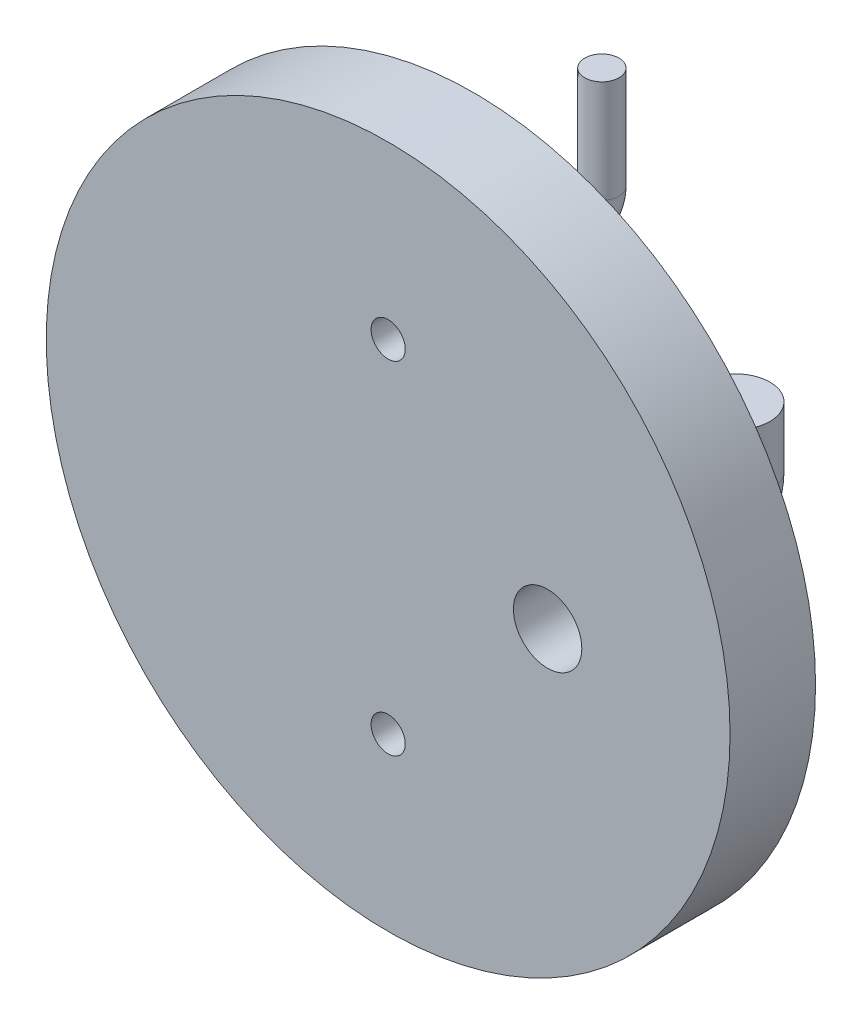
ISO-10303-21;
HEADER;
FILE_DESCRIPTION(('STEP AP214'),'2;1');
FILE_NAME('part.step','',(''),(''),'','','');
FILE_SCHEMA(('AUTOMOTIVE_DESIGN { 1 0 10303 214 1 1 1 1 }'));
ENDSEC;
DATA;
#1=APPLICATION_CONTEXT('core data for automotive mechanical design processes');
#2=APPLICATION_PROTOCOL_DEFINITION('international standard','automotive_design',2000,#1);
#3=PRODUCT_CONTEXT('',#1,'mechanical');
#4=PRODUCT('Part','Part','',(#3));
#5=PRODUCT_RELATED_PRODUCT_CATEGORY('part','',(#4));
#6=PRODUCT_DEFINITION_FORMATION('','',#4);
#7=PRODUCT_DEFINITION_CONTEXT('part definition',#1,'design');
#8=PRODUCT_DEFINITION('design','',#6,#7);
#9=PRODUCT_DEFINITION_SHAPE('','',#8);
#10=(LENGTH_UNIT() NAMED_UNIT(*) SI_UNIT(.MILLI.,.METRE.));
#11=(NAMED_UNIT(*) PLANE_ANGLE_UNIT() SI_UNIT($,.RADIAN.));
#12=(NAMED_UNIT(*) SI_UNIT($,.STERADIAN.) SOLID_ANGLE_UNIT());
#13=UNCERTAINTY_MEASURE_WITH_UNIT(LENGTH_MEASURE(1.E-05),#10,'distance_accuracy_value','');
#14=(GEOMETRIC_REPRESENTATION_CONTEXT(3) GLOBAL_UNCERTAINTY_ASSIGNED_CONTEXT((#13)) GLOBAL_UNIT_ASSIGNED_CONTEXT((#10,
#11,#12)) REPRESENTATION_CONTEXT('',''));
#15=CARTESIAN_POINT('',(0.,0.,0.));
#16=DIRECTION('',(0.,0.,1.));
#17=DIRECTION('',(1.,0.,0.));
#18=AXIS2_PLACEMENT_3D('',#15,#16,#17);
#19=CARTESIAN_POINT('',(18.6528025804478,5.00000000000004,-12.));
#20=DIRECTION('',(0.,1.,0.));
#21=DIRECTION('',(0.,0.,1.));
#22=AXIS2_PLACEMENT_3D('',#19,#20,#21);
#23=CYLINDRICAL_SURFACE('',#22,4.);
#24=CARTESIAN_POINT('',(18.6528025804478,5.00000000000004,-12.));
#25=DIRECTION('',(0.,-1.,0.));
#26=DIRECTION('',(1.,0.,0.));
#27=AXIS2_PLACEMENT_3D('',#24,#25,#26);
#28=CIRCLE('',#27,4.);
#29=CARTESIAN_POINT('',(18.6528025804478,5.00000000000007,-16.));
#30=VERTEX_POINT('',#29);
#31=EDGE_CURVE('E46',#30,#30,#28,.T.);
#32=ORIENTED_EDGE('',*,*,#31,.F.);
#33=EDGE_LOOP('',(#32));
#34=FACE_BOUND('',#33,.T.);
#35=CARTESIAN_POINT('',(18.6528025804478,12.,-12.));
#36=DIRECTION('',(0.,-1.,0.));
#37=DIRECTION('',(1.,0.,0.));
#38=AXIS2_PLACEMENT_3D('',#35,#36,#37);
#39=CIRCLE('',#38,4.);
#40=CARTESIAN_POINT('',(22.6528025804478,12.,-12.));
#41=VERTEX_POINT('',#40);
#42=EDGE_CURVE('E11',#41,#41,#39,.T.);
#43=ORIENTED_EDGE('',*,*,#42,.T.);
#44=EDGE_LOOP('',(#43));
#45=FACE_BOUND('',#44,.T.);
#46=ADVANCED_FACE('F40',(#34,#45),#23,.T.);
#47=CARTESIAN_POINT('',(18.6528025804478,5.,-7.));
#48=DIRECTION('',(1.,0.,0.));
#49=DIRECTION('',(0.,0.,-1.));
#50=AXIS2_PLACEMENT_3D('',#47,#48,#49);
#51=TOROIDAL_SURFACE('',#50,5.,4.);
#52=CARTESIAN_POINT('',(18.6528025804478,0.,-6.99999999999996));
#53=DIRECTION('',(0.,0.,1.));
#54=DIRECTION('',(1.,0.,0.));
#55=AXIS2_PLACEMENT_3D('',#52,#53,#54);
#56=CIRCLE('',#55,4.);
#57=CARTESIAN_POINT('',(18.6528025804478,-4.,-6.99999999999994));
#58=VERTEX_POINT('',#57);
#59=EDGE_CURVE('E50',#58,#58,#56,.T.);
#60=CARTESIAN_POINT('',(18.6528025804478,5.,-7.));
#61=DIRECTION('',(1.,0.,0.));
#62=DIRECTION('',(0.,0.,-1.));
#63=AXIS2_PLACEMENT_3D('',#60,#61,#62);
#64=CIRCLE('',#63,9.);
#65=EDGE_CURVE('',#58,#30,#64,.T.);
#66=ORIENTED_EDGE('',*,*,#59,.F.);
#67=ORIENTED_EDGE('',*,*,#31,.T.);
#68=ORIENTED_EDGE('',*,*,#65,.T.);
#69=ORIENTED_EDGE('',*,*,#65,.F.);
#70=EDGE_LOOP('',(#66,#68,#67,#69));
#71=FACE_BOUND('',#70,.T.);
#72=ADVANCED_FACE('F65',(#71),#51,.T.);
#73=CARTESIAN_POINT('',(18.6528025804478,0.,-6.99999999999996));
#74=DIRECTION('',(0.,0.,1.));
#75=DIRECTION('',(1.,0.,0.));
#76=AXIS2_PLACEMENT_3D('',#73,#74,#75);
#77=CYLINDRICAL_SURFACE('',#76,4.);
#78=ORIENTED_EDGE('',*,*,#59,.T.);
#79=EDGE_LOOP('',(#78));
#80=FACE_BOUND('',#79,.T.);
#81=CARTESIAN_POINT('',(18.6528025804478,0.,0.));
#82=DIRECTION('',(0.,0.,1.));
#83=DIRECTION('',(1.,0.,0.));
#84=AXIS2_PLACEMENT_3D('',#81,#82,#83);
#85=CIRCLE('',#84,4.);
#86=CARTESIAN_POINT('',(22.6528025804478,0.,0.));
#87=VERTEX_POINT('',#86);
#88=EDGE_CURVE('E54',#87,#87,#85,.T.);
#89=ORIENTED_EDGE('',*,*,#88,.F.);
#90=EDGE_LOOP('',(#89));
#91=FACE_BOUND('',#90,.T.);
#92=ADVANCED_FACE('F62',(#80,#91),#77,.T.);
#93=CARTESIAN_POINT('',(18.6528025804478,12.,-12.));
#94=DIRECTION('',(0.,-1.,0.));
#95=DIRECTION('',(1.,0.,0.));
#96=AXIS2_PLACEMENT_3D('',#93,#94,#95);
#97=PLANE('',#96);
#98=ORIENTED_EDGE('',*,*,#42,.F.);
#99=EDGE_LOOP('',(#98));
#100=FACE_BOUND('',#99,.T.);
#101=ADVANCED_FACE('F64',(#100),#97,.F.);
#102=CARTESIAN_POINT('',(18.6528025804478,0.,0.));
#103=DIRECTION('',(0.,0.,1.));
#104=DIRECTION('',(1.,0.,0.));
#105=AXIS2_PLACEMENT_3D('',#102,#103,#104);
#106=PLANE('',#105);
#107=ORIENTED_EDGE('',*,*,#88,.T.);
#108=EDGE_LOOP('',(#107));
#109=FACE_BOUND('',#108,.T.);
#110=ADVANCED_FACE('F60',(#109),#106,.T.);
#111=CLOSED_SHELL('',(#46,#72,#92,#101,#110));
#112=MANIFOLD_SOLID_BREP('B2',#111);
#113=CARTESIAN_POINT('',(0.,23.,-15.));
#114=DIRECTION('',(0.,1.,0.));
#115=DIRECTION('',(0.,0.,1.));
#116=AXIS2_PLACEMENT_3D('',#113,#114,#115);
#117=CYLINDRICAL_SURFACE('',#116,2.);
#118=CARTESIAN_POINT('',(0.,23.,-15.));
#119=DIRECTION('',(0.,1.,0.));
#120=DIRECTION('',(-1.,0.,0.));
#121=AXIS2_PLACEMENT_3D('',#118,#119,#120);
#122=CIRCLE('',#121,2.);
#123=CARTESIAN_POINT('',(0.,23.,-17.));
#124=VERTEX_POINT('',#123);
#125=EDGE_CURVE('E125',#124,#124,#122,.T.);
#126=ORIENTED_EDGE('',*,*,#125,.T.);
#127=EDGE_LOOP('',(#126));
#128=FACE_BOUND('',#127,.T.);
#129=CARTESIAN_POINT('',(0.,35.,-15.));
#130=DIRECTION('',(0.,1.,0.));
#131=DIRECTION('',(-1.,0.,0.));
#132=AXIS2_PLACEMENT_3D('',#129,#130,#131);
#133=CIRCLE('',#132,2.);
#134=CARTESIAN_POINT('',(-2.,35.,-15.));
#135=VERTEX_POINT('',#134);
#136=EDGE_CURVE('E39',#135,#135,#133,.T.);
#137=ORIENTED_EDGE('',*,*,#136,.F.);
#138=EDGE_LOOP('',(#137));
#139=FACE_BOUND('',#138,.T.);
#140=ADVANCED_FACE('F119',(#128,#139),#117,.T.);
#141=CARTESIAN_POINT('',(0.,23.,-12.));
#142=DIRECTION('',(1.,0.,0.));
#143=DIRECTION('',(0.,0.,-1.));
#144=AXIS2_PLACEMENT_3D('',#141,#142,#143);
#145=TOROIDAL_SURFACE('',#144,3.,2.);
#146=CARTESIAN_POINT('',(0.,20.,-12.));
#147=DIRECTION('',(0.,0.,-1.));
#148=DIRECTION('',(-1.,0.,0.));
#149=AXIS2_PLACEMENT_3D('',#146,#147,#148);
#150=CIRCLE('',#149,2.);
#151=CARTESIAN_POINT('',(0.,18.,-12.));
#152=VERTEX_POINT('',#151);
#153=EDGE_CURVE('E129',#152,#152,#150,.T.);
#154=CARTESIAN_POINT('',(0.,23.,-12.));
#155=DIRECTION('',(1.,0.,0.));
#156=DIRECTION('',(0.,0.,-1.));
#157=AXIS2_PLACEMENT_3D('',#154,#155,#156);
#158=CIRCLE('',#157,5.);
#159=EDGE_CURVE('',#152,#124,#158,.T.);
#160=ORIENTED_EDGE('',*,*,#153,.T.);
#161=ORIENTED_EDGE('',*,*,#125,.F.);
#162=ORIENTED_EDGE('',*,*,#159,.T.);
#163=ORIENTED_EDGE('',*,*,#159,.F.);
#164=EDGE_LOOP('',(#160,#162,#161,#163));
#165=FACE_BOUND('',#164,.T.);
#166=ADVANCED_FACE('F151',(#165),#145,.T.);
#167=CARTESIAN_POINT('',(0.,20.,-12.));
#168=DIRECTION('',(0.,0.,1.));
#169=DIRECTION('',(0.,-1.,0.));
#170=AXIS2_PLACEMENT_3D('',#167,#168,#169);
#171=CYLINDRICAL_SURFACE('',#170,2.);
#172=CARTESIAN_POINT('',(0.,20.,0.));
#173=DIRECTION('',(0.,0.,-1.));
#174=DIRECTION('',(-1.,0.,0.));
#175=AXIS2_PLACEMENT_3D('',#172,#173,#174);
#176=CIRCLE('',#175,2.);
#177=CARTESIAN_POINT('',(0.,18.,0.));
#178=VERTEX_POINT('',#177);
#179=EDGE_CURVE('E133',#178,#178,#176,.T.);
#180=CARTESIAN_POINT('',(0.,18.,-12.));
#181=CARTESIAN_POINT('',(0.,18.,-11.875));
#182=CARTESIAN_POINT('',(0.,18.,-11.75));
#183=CARTESIAN_POINT('',(0.,18.,-11.5));
#184=CARTESIAN_POINT('',(0.,18.,-11.375));
#185=CARTESIAN_POINT('',(0.,18.,-11.125));
#186=CARTESIAN_POINT('',(0.,18.,-11.));
#187=CARTESIAN_POINT('',(0.,18.,-10.75));
#188=CARTESIAN_POINT('',(0.,18.,-10.625));
#189=CARTESIAN_POINT('',(0.,18.,-10.375));
#190=CARTESIAN_POINT('',(0.,18.,-10.25));
#191=CARTESIAN_POINT('',(0.,18.,-10.));
#192=CARTESIAN_POINT('',(0.,18.,-9.875));
#193=CARTESIAN_POINT('',(0.,18.,-9.625));
#194=CARTESIAN_POINT('',(0.,18.,-9.5));
#195=CARTESIAN_POINT('',(0.,18.,-9.25));
#196=CARTESIAN_POINT('',(0.,18.,-9.125));
#197=CARTESIAN_POINT('',(0.,18.,-8.875));
#198=CARTESIAN_POINT('',(0.,18.,-8.75));
#199=CARTESIAN_POINT('',(0.,18.,-8.5));
#200=CARTESIAN_POINT('',(0.,18.,-8.375));
#201=CARTESIAN_POINT('',(0.,18.,-8.125));
#202=CARTESIAN_POINT('',(0.,18.,-8.));
#203=CARTESIAN_POINT('',(0.,18.,-7.75));
#204=CARTESIAN_POINT('',(0.,18.,-7.625));
#205=CARTESIAN_POINT('',(0.,18.,-7.375));
#206=CARTESIAN_POINT('',(0.,18.,-7.25));
#207=CARTESIAN_POINT('',(0.,18.,-7.));
#208=CARTESIAN_POINT('',(0.,18.,-6.875));
#209=CARTESIAN_POINT('',(0.,18.,-6.625));
#210=CARTESIAN_POINT('',(0.,18.,-6.5));
#211=CARTESIAN_POINT('',(0.,18.,-6.25));
#212=CARTESIAN_POINT('',(0.,18.,-6.125));
#213=CARTESIAN_POINT('',(0.,18.,-5.875));
#214=CARTESIAN_POINT('',(0.,18.,-5.75));
#215=CARTESIAN_POINT('',(0.,18.,-5.5));
#216=CARTESIAN_POINT('',(0.,18.,-5.375));
#217=CARTESIAN_POINT('',(0.,18.,-5.125));
#218=CARTESIAN_POINT('',(0.,18.,-5.));
#219=CARTESIAN_POINT('',(0.,18.,-4.75));
#220=CARTESIAN_POINT('',(0.,18.,-4.625));
#221=CARTESIAN_POINT('',(0.,18.,-4.375));
#222=CARTESIAN_POINT('',(0.,18.,-4.25));
#223=CARTESIAN_POINT('',(0.,18.,-4.));
#224=CARTESIAN_POINT('',(0.,18.,-3.875));
#225=CARTESIAN_POINT('',(0.,18.,-3.625));
#226=CARTESIAN_POINT('',(0.,18.,-3.5));
#227=CARTESIAN_POINT('',(0.,18.,-3.25));
#228=CARTESIAN_POINT('',(0.,18.,-3.125));
#229=CARTESIAN_POINT('',(0.,18.,-2.875));
#230=CARTESIAN_POINT('',(0.,18.,-2.75));
#231=CARTESIAN_POINT('',(0.,18.,-2.5));
#232=CARTESIAN_POINT('',(0.,18.,-2.375));
#233=CARTESIAN_POINT('',(0.,18.,-2.125));
#234=CARTESIAN_POINT('',(0.,18.,-2.));
#235=CARTESIAN_POINT('',(0.,18.,-1.75));
#236=CARTESIAN_POINT('',(0.,18.,-1.625));
#237=CARTESIAN_POINT('',(0.,18.,-1.375));
#238=CARTESIAN_POINT('',(0.,18.,-1.25));
#239=CARTESIAN_POINT('',(0.,18.,-1.));
#240=CARTESIAN_POINT('',(0.,18.,-0.875000000000001));
#241=CARTESIAN_POINT('',(0.,18.,-0.625000000000001));
#242=CARTESIAN_POINT('',(0.,18.,-0.5));
#243=CARTESIAN_POINT('',(0.,18.,-0.25));
#244=CARTESIAN_POINT('',(0.,18.,-0.125));
#245=CARTESIAN_POINT('',(0.,18.,0.));
#246=B_SPLINE_CURVE_WITH_KNOTS('',3,(#180,#181,#182,#183,#184,#185,#186,#187,#188,#189,#190,
#191,#192,#193,#194,#195,#196,#197,#198,#199,#200,#201,#202,#203,#204,#205,#206,#207,#208,#209,
#210,#211,#212,#213,#214,#215,#216,#217,#218,#219,#220,#221,#222,#223,#224,#225,#226,#227,#228,
#229,#230,#231,#232,#233,#234,#235,#236,#237,#238,#239,#240,#241,#242,#243,#244,#245),
.UNSPECIFIED.,.F.,.F.,(4,2,2,2,2,2,2,2,2,2,2,2,2,2,2,2,2,2,2,2,2,2,2,2,2,2,2,2,2,2,2,2,4),(0.,
0.375,0.750000000000001,1.125,1.5,1.875,2.25,2.625,3.,3.375,3.75,4.125,4.5,4.875,5.25,5.625,6.,
6.375,6.75,7.125,7.5,7.875,8.25,8.625,9.,9.375,9.75,10.125,10.5,10.875,11.25,11.625,12.),.UNSPECIFIED.);
#247=EDGE_CURVE('BSEAM139',#152,#178,#246,.T.);
#248=ORIENTED_EDGE('',*,*,#153,.F.);
#249=ORIENTED_EDGE('',*,*,#179,.T.);
#250=ORIENTED_EDGE('',*,*,#247,.T.);
#251=ORIENTED_EDGE('',*,*,#247,.F.);
#252=EDGE_LOOP('',(#248,#250,#249,#251));
#253=FACE_BOUND('',#252,.T.);
#254=ADVANCED_FACE('F139',(#253),#171,.T.);
#255=CARTESIAN_POINT('',(0.,35.,-15.));
#256=DIRECTION('',(0.,1.,0.));
#257=DIRECTION('',(-1.,0.,0.));
#258=AXIS2_PLACEMENT_3D('',#255,#256,#257);
#259=PLANE('',#258);
#260=ORIENTED_EDGE('',*,*,#136,.T.);
#261=EDGE_LOOP('',(#260));
#262=FACE_BOUND('',#261,.T.);
#263=ADVANCED_FACE('F143',(#262),#259,.T.);
#264=CARTESIAN_POINT('',(0.,20.,0.));
#265=DIRECTION('',(0.,0.,-1.));
#266=DIRECTION('',(-1.,0.,0.));
#267=AXIS2_PLACEMENT_3D('',#264,#265,#266);
#268=PLANE('',#267);
#269=ORIENTED_EDGE('',*,*,#179,.F.);
#270=EDGE_LOOP('',(#269));
#271=FACE_BOUND('',#270,.T.);
#272=ADVANCED_FACE('F141',(#271),#268,.F.);
#273=CLOSED_SHELL('',(#140,#166,#254,#263,#272));
#274=MANIFOLD_SOLID_BREP('B6',#273);
#275=CARTESIAN_POINT('',(0.,-23.,-15.));
#276=DIRECTION('',(0.,-1.,0.));
#277=DIRECTION('',(0.,0.,-1.));
#278=AXIS2_PLACEMENT_3D('',#275,#276,#277);
#279=CYLINDRICAL_SURFACE('',#278,2.);
#280=CARTESIAN_POINT('',(0.,-23.,-15.));
#281=DIRECTION('',(0.,1.,0.));
#282=DIRECTION('',(1.,0.,0.));
#283=AXIS2_PLACEMENT_3D('',#280,#281,#282);
#284=CIRCLE('',#283,2.);
#285=CARTESIAN_POINT('',(0.,-23.,-17.));
#286=VERTEX_POINT('',#285);
#287=EDGE_CURVE('E203',#286,#286,#284,.T.);
#288=ORIENTED_EDGE('',*,*,#287,.F.);
#289=EDGE_LOOP('',(#288));
#290=FACE_BOUND('',#289,.T.);
#291=CARTESIAN_POINT('',(0.,-35.,-15.));
#292=DIRECTION('',(0.,1.,0.));
#293=DIRECTION('',(1.,0.,0.));
#294=AXIS2_PLACEMENT_3D('',#291,#292,#293);
#295=CIRCLE('',#294,2.);
#296=CARTESIAN_POINT('',(2.,-35.,-15.));
#297=VERTEX_POINT('',#296);
#298=EDGE_CURVE('E118',#297,#297,#295,.T.);
#299=ORIENTED_EDGE('',*,*,#298,.T.);
#300=EDGE_LOOP('',(#299));
#301=FACE_BOUND('',#300,.T.);
#302=ADVANCED_FACE('F197',(#290,#301),#279,.T.);
#303=CARTESIAN_POINT('',(0.,-23.,-12.));
#304=DIRECTION('',(-1.,0.,0.));
#305=DIRECTION('',(0.,0.,1.));
#306=AXIS2_PLACEMENT_3D('',#303,#304,#305);
#307=TOROIDAL_SURFACE('',#306,3.,2.);
#308=CARTESIAN_POINT('',(0.,-20.,-12.));
#309=DIRECTION('',(0.,0.,1.));
#310=DIRECTION('',(1.,0.,0.));
#311=AXIS2_PLACEMENT_3D('',#308,#309,#310);
#312=CIRCLE('',#311,2.);
#313=CARTESIAN_POINT('',(0.,-18.,-12.));
#314=VERTEX_POINT('',#313);
#315=EDGE_CURVE('E207',#314,#314,#312,.T.);
#316=CARTESIAN_POINT('',(0.,-23.,-12.));
#317=DIRECTION('',(-1.,0.,0.));
#318=DIRECTION('',(0.,0.,1.));
#319=AXIS2_PLACEMENT_3D('',#316,#317,#318);
#320=CIRCLE('',#319,5.);
#321=EDGE_CURVE('',#314,#286,#320,.T.);
#322=ORIENTED_EDGE('',*,*,#315,.F.);
#323=ORIENTED_EDGE('',*,*,#287,.T.);
#324=ORIENTED_EDGE('',*,*,#321,.T.);
#325=ORIENTED_EDGE('',*,*,#321,.F.);
#326=EDGE_LOOP('',(#322,#324,#323,#325));
#327=FACE_BOUND('',#326,.T.);
#328=ADVANCED_FACE('F222',(#327),#307,.T.);
#329=CARTESIAN_POINT('',(0.,-20.,-12.));
#330=DIRECTION('',(0.,0.,1.));
#331=DIRECTION('',(1.,0.,0.));
#332=AXIS2_PLACEMENT_3D('',#329,#330,#331);
#333=CYLINDRICAL_SURFACE('',#332,2.);
#334=ORIENTED_EDGE('',*,*,#315,.T.);
#335=EDGE_LOOP('',(#334));
#336=FACE_BOUND('',#335,.T.);
#337=CARTESIAN_POINT('',(0.,-20.,0.));
#338=DIRECTION('',(0.,0.,1.));
#339=DIRECTION('',(1.,0.,0.));
#340=AXIS2_PLACEMENT_3D('',#337,#338,#339);
#341=CIRCLE('',#340,2.);
#342=CARTESIAN_POINT('',(2.,-20.,0.));
#343=VERTEX_POINT('',#342);
#344=EDGE_CURVE('E211',#343,#343,#341,.T.);
#345=ORIENTED_EDGE('',*,*,#344,.F.);
#346=EDGE_LOOP('',(#345));
#347=FACE_BOUND('',#346,.T.);
#348=ADVANCED_FACE('F219',(#336,#347),#333,.T.);
#349=CARTESIAN_POINT('',(0.,-35.,-15.));
#350=DIRECTION('',(0.,1.,0.));
#351=DIRECTION('',(1.,0.,0.));
#352=AXIS2_PLACEMENT_3D('',#349,#350,#351);
#353=PLANE('',#352);
#354=ORIENTED_EDGE('',*,*,#298,.F.);
#355=EDGE_LOOP('',(#354));
#356=FACE_BOUND('',#355,.T.);
#357=ADVANCED_FACE('F221',(#356),#353,.F.);
#358=CARTESIAN_POINT('',(0.,-20.,0.));
#359=DIRECTION('',(0.,0.,1.));
#360=DIRECTION('',(1.,0.,0.));
#361=AXIS2_PLACEMENT_3D('',#358,#359,#360);
#362=PLANE('',#361);
#363=ORIENTED_EDGE('',*,*,#344,.T.);
#364=EDGE_LOOP('',(#363));
#365=FACE_BOUND('',#364,.T.);
#366=ADVANCED_FACE('F217',(#365),#362,.T.);
#367=CLOSED_SHELL('',(#302,#328,#348,#357,#366));
#368=MANIFOLD_SOLID_BREP('B34',#367);
#369=CARTESIAN_POINT('',(0.,0.,10.));
#370=DIRECTION('',(0.,0.,1.));
#371=DIRECTION('',(1.,0.,0.));
#372=AXIS2_PLACEMENT_3D('',#369,#370,#371);
#373=PLANE('',#372);
#374=CARTESIAN_POINT('',(0.,-20.,10.));
#375=DIRECTION('',(0.,0.,1.));
#376=DIRECTION('',(1.,0.,0.));
#377=AXIS2_PLACEMENT_3D('',#374,#375,#376);
#378=CIRCLE('',#377,2.);
#379=CARTESIAN_POINT('',(2.,-20.,10.));
#380=VERTEX_POINT('',#379);
#381=EDGE_CURVE('E284',#380,#380,#378,.T.);
#382=ORIENTED_EDGE('',*,*,#381,.F.);
#383=EDGE_LOOP('',(#382));
#384=FACE_BOUND('',#383,.T.);
#385=CARTESIAN_POINT('',(0.,0.,10.));
#386=DIRECTION('',(0.,0.,1.));
#387=DIRECTION('',(1.,0.,0.));
#388=AXIS2_PLACEMENT_3D('',#385,#386,#387);
#389=CIRCLE('',#388,40.);
#390=CARTESIAN_POINT('',(40.,0.,10.));
#391=VERTEX_POINT('',#390);
#392=EDGE_CURVE('E196',#391,#391,#389,.T.);
#393=ORIENTED_EDGE('',*,*,#392,.T.);
#394=EDGE_LOOP('',(#393));
#395=FACE_BOUND('',#394,.T.);
#396=CARTESIAN_POINT('',(0.,20.,10.));
#397=DIRECTION('',(0.,0.,1.));
#398=DIRECTION('',(1.,0.,0.));
#399=AXIS2_PLACEMENT_3D('',#396,#397,#398);
#400=CIRCLE('',#399,2.);
#401=CARTESIAN_POINT('',(2.,20.,10.));
#402=VERTEX_POINT('',#401);
#403=EDGE_CURVE('E279',#402,#402,#400,.T.);
#404=ORIENTED_EDGE('',*,*,#403,.F.);
#405=EDGE_LOOP('',(#404));
#406=FACE_BOUND('',#405,.T.);
#407=CARTESIAN_POINT('',(18.6528025804478,0.,10.));
#408=DIRECTION('',(0.,0.,1.));
#409=DIRECTION('',(1.,0.,0.));
#410=AXIS2_PLACEMENT_3D('',#407,#408,#409);
#411=CIRCLE('',#410,4.);
#412=CARTESIAN_POINT('',(22.6528025804478,0.,10.));
#413=VERTEX_POINT('',#412);
#414=EDGE_CURVE('E290',#413,#413,#411,.T.);
#415=ORIENTED_EDGE('',*,*,#414,.F.);
#416=EDGE_LOOP('',(#415));
#417=FACE_BOUND('',#416,.T.);
#418=ADVANCED_FACE('F268',(#384,#395,#406,#417),#373,.T.);
#419=CARTESIAN_POINT('',(0.,0.,0.));
#420=DIRECTION('',(0.,0.,1.));
#421=DIRECTION('',(1.,0.,0.));
#422=AXIS2_PLACEMENT_3D('',#419,#420,#421);
#423=PLANE('',#422);
#424=CARTESIAN_POINT('',(0.,0.,0.));
#425=DIRECTION('',(0.,0.,1.));
#426=DIRECTION('',(1.,0.,0.));
#427=AXIS2_PLACEMENT_3D('',#424,#425,#426);
#428=CIRCLE('',#427,40.);
#429=CARTESIAN_POINT('',(40.,0.,0.));
#430=VERTEX_POINT('',#429);
#431=EDGE_CURVE('E272',#430,#430,#428,.T.);
#432=ORIENTED_EDGE('',*,*,#431,.F.);
#433=EDGE_LOOP('',(#432));
#434=FACE_BOUND('',#433,.T.);
#435=CARTESIAN_POINT('',(0.,20.,0.));
#436=DIRECTION('',(0.,0.,1.));
#437=DIRECTION('',(1.,0.,0.));
#438=AXIS2_PLACEMENT_3D('',#435,#436,#437);
#439=CIRCLE('',#438,2.);
#440=CARTESIAN_POINT('',(2.,20.,0.));
#441=VERTEX_POINT('',#440);
#442=EDGE_CURVE('E281',#441,#441,#439,.T.);
#443=ORIENTED_EDGE('',*,*,#442,.T.);
#444=EDGE_LOOP('',(#443));
#445=FACE_BOUND('',#444,.T.);
#446=CARTESIAN_POINT('',(0.,-20.,0.));
#447=DIRECTION('',(0.,0.,1.));
#448=DIRECTION('',(1.,0.,0.));
#449=AXIS2_PLACEMENT_3D('',#446,#447,#448);
#450=CIRCLE('',#449,2.);
#451=CARTESIAN_POINT('',(2.,-20.,0.));
#452=VERTEX_POINT('',#451);
#453=EDGE_CURVE('E287',#452,#452,#450,.T.);
#454=ORIENTED_EDGE('',*,*,#453,.T.);
#455=EDGE_LOOP('',(#454));
#456=FACE_BOUND('',#455,.T.);
#457=CARTESIAN_POINT('',(18.6528025804478,0.,0.));
#458=DIRECTION('',(0.,0.,1.));
#459=DIRECTION('',(1.,0.,0.));
#460=AXIS2_PLACEMENT_3D('',#457,#458,#459);
#461=CIRCLE('',#460,4.);
#462=CARTESIAN_POINT('',(22.6528025804478,0.,0.));
#463=VERTEX_POINT('',#462);
#464=EDGE_CURVE('E293',#463,#463,#461,.T.);
#465=ORIENTED_EDGE('',*,*,#464,.T.);
#466=EDGE_LOOP('',(#465));
#467=FACE_BOUND('',#466,.T.);
#468=ADVANCED_FACE('F303',(#434,#445,#456,#467),#423,.F.);
#469=CARTESIAN_POINT('',(0.,0.,10.));
#470=DIRECTION('',(0.,0.,-1.));
#471=DIRECTION('',(-1.,0.,0.));
#472=AXIS2_PLACEMENT_3D('',#469,#470,#471);
#473=CYLINDRICAL_SURFACE('',#472,40.);
#474=ORIENTED_EDGE('',*,*,#392,.F.);
#475=EDGE_LOOP('',(#474));
#476=FACE_BOUND('',#475,.T.);
#477=ORIENTED_EDGE('',*,*,#431,.T.);
#478=EDGE_LOOP('',(#477));
#479=FACE_BOUND('',#478,.T.);
#480=ADVANCED_FACE('F270',(#476,#479),#473,.T.);
#481=CARTESIAN_POINT('',(0.,20.,10.));
#482=DIRECTION('',(0.,0.,-1.));
#483=DIRECTION('',(-1.,0.,0.));
#484=AXIS2_PLACEMENT_3D('',#481,#482,#483);
#485=CYLINDRICAL_SURFACE('',#484,2.);
#486=ORIENTED_EDGE('',*,*,#403,.T.);
#487=EDGE_LOOP('',(#486));
#488=FACE_BOUND('',#487,.T.);
#489=ORIENTED_EDGE('',*,*,#442,.F.);
#490=EDGE_LOOP('',(#489));
#491=FACE_BOUND('',#490,.T.);
#492=ADVANCED_FACE('F312',(#488,#491),#485,.F.);
#493=CARTESIAN_POINT('',(0.,-20.,10.));
#494=DIRECTION('',(0.,0.,-1.));
#495=DIRECTION('',(-1.,0.,0.));
#496=AXIS2_PLACEMENT_3D('',#493,#494,#495);
#497=CYLINDRICAL_SURFACE('',#496,2.);
#498=ORIENTED_EDGE('',*,*,#381,.T.);
#499=EDGE_LOOP('',(#498));
#500=FACE_BOUND('',#499,.T.);
#501=ORIENTED_EDGE('',*,*,#453,.F.);
#502=EDGE_LOOP('',(#501));
#503=FACE_BOUND('',#502,.T.);
#504=ADVANCED_FACE('F315',(#500,#503),#497,.F.);
#505=CARTESIAN_POINT('',(18.6528025804478,0.,10.));
#506=DIRECTION('',(0.,0.,-1.));
#507=DIRECTION('',(-1.,0.,0.));
#508=AXIS2_PLACEMENT_3D('',#505,#506,#507);
#509=CYLINDRICAL_SURFACE('',#508,4.);
#510=ORIENTED_EDGE('',*,*,#414,.T.);
#511=EDGE_LOOP('',(#510));
#512=FACE_BOUND('',#511,.T.);
#513=ORIENTED_EDGE('',*,*,#464,.F.);
#514=EDGE_LOOP('',(#513));
#515=FACE_BOUND('',#514,.T.);
#516=ADVANCED_FACE('F299',(#512,#515),#509,.F.);
#517=CLOSED_SHELL('',(#418,#468,#480,#492,#504,#516));
#518=MANIFOLD_SOLID_BREP('B113',#517);
#519=ADVANCED_BREP_SHAPE_REPRESENTATION('',(#18,#112,#274,#368,#518),#14);
#520=SHAPE_DEFINITION_REPRESENTATION(#9,#519);
ENDSEC;
END-ISO-10303-21;
